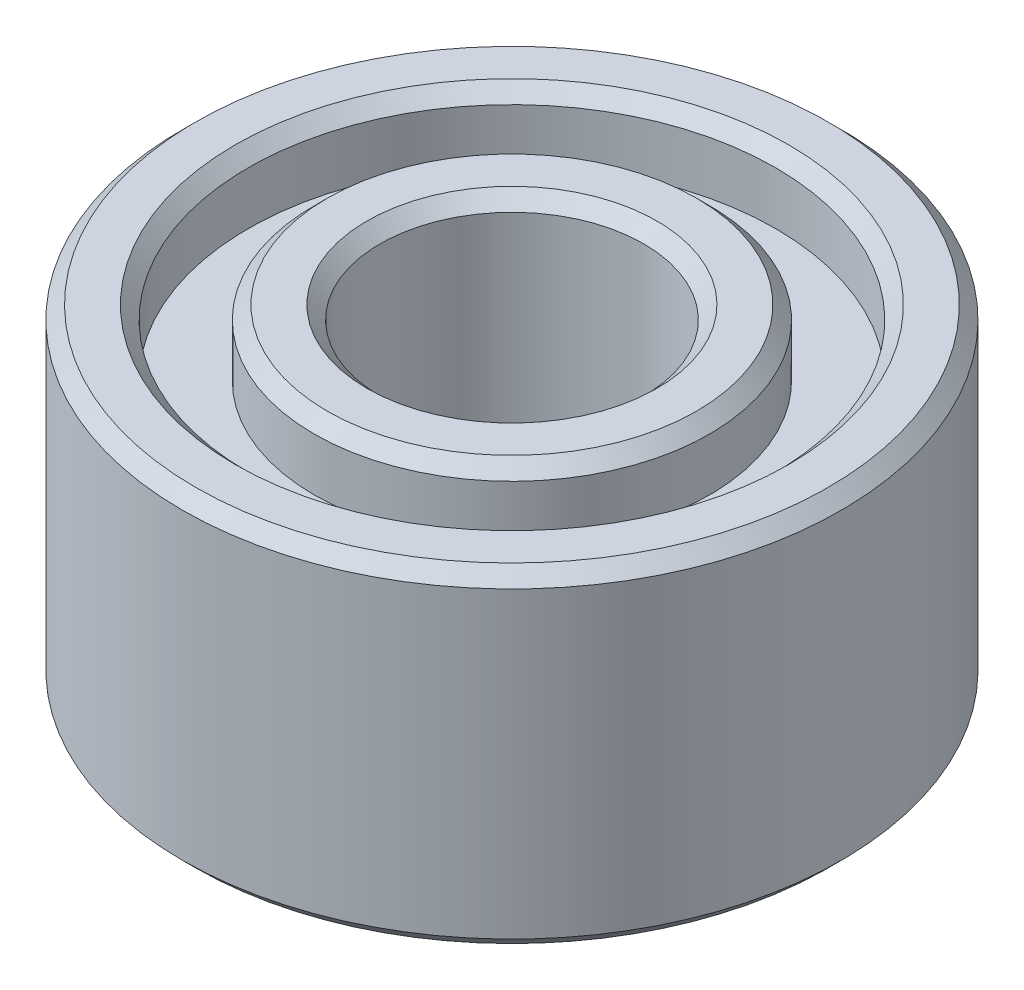
ISO-10303-21;
HEADER;
FILE_DESCRIPTION(('STEP AP214'),'2;1');
FILE_NAME('part.step','',(''),(''),'','','');
FILE_SCHEMA(('AUTOMOTIVE_DESIGN { 1 0 10303 214 1 1 1 1 }'));
ENDSEC;
DATA;
#1=APPLICATION_CONTEXT('core data for automotive mechanical design processes');
#2=APPLICATION_PROTOCOL_DEFINITION('international standard','automotive_design',2000,#1);
#3=PRODUCT_CONTEXT('',#1,'mechanical');
#4=PRODUCT('Part','Part','',(#3));
#5=PRODUCT_RELATED_PRODUCT_CATEGORY('part','',(#4));
#6=PRODUCT_DEFINITION_FORMATION('','',#4);
#7=PRODUCT_DEFINITION_CONTEXT('part definition',#1,'design');
#8=PRODUCT_DEFINITION('design','',#6,#7);
#9=PRODUCT_DEFINITION_SHAPE('','',#8);
#10=(LENGTH_UNIT() NAMED_UNIT(*) SI_UNIT(.MILLI.,.METRE.));
#11=(NAMED_UNIT(*) PLANE_ANGLE_UNIT() SI_UNIT($,.RADIAN.));
#12=(NAMED_UNIT(*) SI_UNIT($,.STERADIAN.) SOLID_ANGLE_UNIT());
#13=UNCERTAINTY_MEASURE_WITH_UNIT(LENGTH_MEASURE(1.E-05),#10,'distance_accuracy_value','');
#14=(GEOMETRIC_REPRESENTATION_CONTEXT(3) GLOBAL_UNCERTAINTY_ASSIGNED_CONTEXT((#13)) GLOBAL_UNIT_ASSIGNED_CONTEXT((#10,
#11,#12)) REPRESENTATION_CONTEXT('',''));
#15=CARTESIAN_POINT('',(0.,0.,0.));
#16=DIRECTION('',(0.,0.,1.));
#17=DIRECTION('',(1.,0.,0.));
#18=AXIS2_PLACEMENT_3D('',#15,#16,#17);
#19=CARTESIAN_POINT('',(0.,0.,0.));
#20=DIRECTION('',(0.,1.,0.));
#21=DIRECTION('',(0.,0.,1.));
#22=AXIS2_PLACEMENT_3D('',#19,#20,#21);
#23=PLANE('',#22);
#24=CARTESIAN_POINT('',(0.,0.,0.));
#25=DIRECTION('',(0.,1.,0.));
#26=DIRECTION('',(0.,0.,1.));
#27=AXIS2_PLACEMENT_3D('',#24,#25,#26);
#28=CIRCLE('',#27,1.);
#29=CARTESIAN_POINT('',(0.,0.,1.));
#30=VERTEX_POINT('',#29);
#31=EDGE_CURVE('E84',#30,#30,#28,.T.);
#32=ORIENTED_EDGE('',*,*,#31,.T.);
#33=EDGE_LOOP('',(#32));
#34=FACE_BOUND('',#33,.T.);
#35=CARTESIAN_POINT('',(0.,0.,0.));
#36=DIRECTION('',(0.,-1.,0.));
#37=DIRECTION('',(0.,0.,-1.));
#38=AXIS2_PLACEMENT_3D('',#35,#36,#37);
#39=CIRCLE('',#38,1.5);
#40=CARTESIAN_POINT('',(0.,0.,-1.5));
#41=VERTEX_POINT('',#40);
#42=EDGE_CURVE('E97',#41,#41,#39,.T.);
#43=ORIENTED_EDGE('',*,*,#42,.T.);
#44=EDGE_LOOP('',(#43));
#45=FACE_BOUND('',#44,.T.);
#46=ADVANCED_FACE('F39',(#34,#45),#23,.F.);
#47=CARTESIAN_POINT('',(0.,2.5,0.));
#48=DIRECTION('',(0.,1.,0.));
#49=DIRECTION('',(0.,0.,1.));
#50=AXIS2_PLACEMENT_3D('',#47,#48,#49);
#51=PLANE('',#50);
#52=CARTESIAN_POINT('',(0.,2.5,0.));
#53=DIRECTION('',(0.,1.,0.));
#54=DIRECTION('',(0.,0.,1.));
#55=AXIS2_PLACEMENT_3D('',#52,#53,#54);
#56=CIRCLE('',#55,1.4);
#57=CARTESIAN_POINT('',(0.,2.5,1.4));
#58=VERTEX_POINT('',#57);
#59=EDGE_CURVE('E63',#58,#58,#56,.T.);
#60=ORIENTED_EDGE('',*,*,#59,.T.);
#61=EDGE_LOOP('',(#60));
#62=FACE_BOUND('',#61,.T.);
#63=CARTESIAN_POINT('',(0.,2.5,0.));
#64=DIRECTION('',(0.,1.,0.));
#65=DIRECTION('',(0.,0.,1.));
#66=AXIS2_PLACEMENT_3D('',#63,#64,#65);
#67=CIRCLE('',#66,1.1);
#68=CARTESIAN_POINT('',(0.,2.5,1.1));
#69=VERTEX_POINT('',#68);
#70=EDGE_CURVE('E66',#69,#69,#67,.F.);
#71=ORIENTED_EDGE('',*,*,#70,.T.);
#72=EDGE_LOOP('',(#71));
#73=FACE_BOUND('',#72,.T.);
#74=ADVANCED_FACE('F125',(#62,#73),#51,.T.);
#75=CARTESIAN_POINT('',(0.,2.5,0.));
#76=DIRECTION('',(0.,1.,0.));
#77=DIRECTION('',(0.,0.,1.));
#78=AXIS2_PLACEMENT_3D('',#75,#76,#77);
#79=CIRCLE('',#78,2.4);
#80=CARTESIAN_POINT('',(0.,2.5,2.4));
#81=VERTEX_POINT('',#80);
#82=EDGE_CURVE('E47',#81,#81,#79,.T.);
#83=ORIENTED_EDGE('',*,*,#82,.T.);
#84=EDGE_LOOP('',(#83));
#85=FACE_BOUND('',#84,.T.);
#86=CARTESIAN_POINT('',(0.,2.5,0.));
#87=DIRECTION('',(0.,1.,0.));
#88=DIRECTION('',(0.,0.,1.));
#89=AXIS2_PLACEMENT_3D('',#86,#87,#88);
#90=CIRCLE('',#89,2.1);
#91=CARTESIAN_POINT('',(0.,2.5,2.1));
#92=VERTEX_POINT('',#91);
#93=EDGE_CURVE('E51',#92,#92,#90,.F.);
#94=ORIENTED_EDGE('',*,*,#93,.T.);
#95=EDGE_LOOP('',(#94));
#96=FACE_BOUND('',#95,.T.);
#97=ADVANCED_FACE('F133',(#85,#96),#51,.T.);
#98=CARTESIAN_POINT('',(0.,0.,0.));
#99=DIRECTION('',(0.,1.,0.));
#100=DIRECTION('',(0.,0.,1.));
#101=AXIS2_PLACEMENT_3D('',#98,#99,#100);
#102=CIRCLE('',#101,2.4);
#103=CARTESIAN_POINT('',(0.,0.,2.4));
#104=VERTEX_POINT('',#103);
#105=EDGE_CURVE('E72',#104,#104,#102,.F.);
#106=ORIENTED_EDGE('',*,*,#105,.T.);
#107=EDGE_LOOP('',(#106));
#108=FACE_BOUND('',#107,.T.);
#109=CARTESIAN_POINT('',(0.,0.,0.));
#110=DIRECTION('',(0.,1.,0.));
#111=DIRECTION('',(0.,0.,1.));
#112=AXIS2_PLACEMENT_3D('',#109,#110,#111);
#113=CIRCLE('',#112,2.1);
#114=CARTESIAN_POINT('',(0.,0.,2.1));
#115=VERTEX_POINT('',#114);
#116=EDGE_CURVE('E75',#115,#115,#113,.T.);
#117=ORIENTED_EDGE('',*,*,#116,.T.);
#118=EDGE_LOOP('',(#117));
#119=FACE_BOUND('',#118,.T.);
#120=ADVANCED_FACE('F128',(#108,#119),#23,.F.);
#121=CARTESIAN_POINT('',(0.,2.5,0.));
#122=DIRECTION('',(0.,-1.,0.));
#123=DIRECTION('',(0.,0.,-1.));
#124=AXIS2_PLACEMENT_3D('',#121,#122,#123);
#125=CYLINDRICAL_SURFACE('',#124,2.5);
#126=CARTESIAN_POINT('',(0.,0.099999999999999,0.));
#127=DIRECTION('',(0.,1.,0.));
#128=DIRECTION('',(0.,0.,1.));
#129=AXIS2_PLACEMENT_3D('',#126,#127,#128);
#130=CIRCLE('',#129,2.5);
#131=CARTESIAN_POINT('',(0.,0.099999999999999,2.5));
#132=VERTEX_POINT('',#131);
#133=EDGE_CURVE('E78',#132,#132,#130,.T.);
#134=ORIENTED_EDGE('',*,*,#133,.T.);
#135=EDGE_LOOP('',(#134));
#136=FACE_BOUND('',#135,.T.);
#137=CARTESIAN_POINT('',(0.,2.4,0.));
#138=DIRECTION('',(0.,1.,0.));
#139=DIRECTION('',(0.,0.,1.));
#140=AXIS2_PLACEMENT_3D('',#137,#138,#139);
#141=CIRCLE('',#140,2.5);
#142=CARTESIAN_POINT('',(0.,2.4,2.5));
#143=VERTEX_POINT('',#142);
#144=EDGE_CURVE('E81',#143,#143,#141,.F.);
#145=ORIENTED_EDGE('',*,*,#144,.T.);
#146=EDGE_LOOP('',(#145));
#147=FACE_BOUND('',#146,.T.);
#148=ADVANCED_FACE('F139',(#136,#147),#125,.T.);
#149=CARTESIAN_POINT('',(0.,2.5,0.));
#150=DIRECTION('',(0.,-1.,0.));
#151=DIRECTION('',(0.,0.,-1.));
#152=AXIS2_PLACEMENT_3D('',#149,#150,#151);
#153=CYLINDRICAL_SURFACE('',#152,1.);
#154=CARTESIAN_POINT('',(0.,2.4,0.));
#155=DIRECTION('',(0.,1.,0.));
#156=DIRECTION('',(0.,0.,1.));
#157=AXIS2_PLACEMENT_3D('',#154,#155,#156);
#158=CIRCLE('',#157,1.);
#159=CARTESIAN_POINT('',(0.,2.4,1.));
#160=VERTEX_POINT('',#159);
#161=EDGE_CURVE('E55',#160,#160,#158,.T.);
#162=ORIENTED_EDGE('',*,*,#161,.T.);
#163=EDGE_LOOP('',(#162));
#164=FACE_BOUND('',#163,.T.);
#165=ORIENTED_EDGE('',*,*,#31,.F.);
#166=EDGE_LOOP('',(#165));
#167=FACE_BOUND('',#166,.T.);
#168=ADVANCED_FACE('F145',(#164,#167),#153,.F.);
#169=CARTESIAN_POINT('',(0.,2.,0.));
#170=DIRECTION('',(0.,1.,0.));
#171=DIRECTION('',(0.,0.,1.));
#172=AXIS2_PLACEMENT_3D('',#169,#170,#171);
#173=CYLINDRICAL_SURFACE('',#172,2.);
#174=CARTESIAN_POINT('',(0.,2.4,0.));
#175=DIRECTION('',(0.,1.,0.));
#176=DIRECTION('',(0.,0.,1.));
#177=AXIS2_PLACEMENT_3D('',#174,#175,#176);
#178=CIRCLE('',#177,2.);
#179=CARTESIAN_POINT('',(0.,2.4,2.));
#180=VERTEX_POINT('',#179);
#181=EDGE_CURVE('E10',#180,#180,#178,.T.);
#182=ORIENTED_EDGE('',*,*,#181,.T.);
#183=EDGE_LOOP('',(#182));
#184=FACE_BOUND('',#183,.T.);
#185=CARTESIAN_POINT('',(0.,2.,0.));
#186=DIRECTION('',(0.,1.,0.));
#187=DIRECTION('',(0.,0.,1.));
#188=AXIS2_PLACEMENT_3D('',#185,#186,#187);
#189=CIRCLE('',#188,2.);
#190=CARTESIAN_POINT('',(0.,2.,2.));
#191=VERTEX_POINT('',#190);
#192=EDGE_CURVE('E87',#191,#191,#189,.T.);
#193=ORIENTED_EDGE('',*,*,#192,.F.);
#194=EDGE_LOOP('',(#193));
#195=FACE_BOUND('',#194,.T.);
#196=ADVANCED_FACE('F261',(#184,#195),#173,.F.);
#197=CARTESIAN_POINT('',(0.,2.,0.));
#198=DIRECTION('',(0.,1.,0.));
#199=DIRECTION('',(0.,0.,1.));
#200=AXIS2_PLACEMENT_3D('',#197,#198,#199);
#201=PLANE('',#200);
#202=CARTESIAN_POINT('',(0.,2.,0.));
#203=DIRECTION('',(0.,1.,0.));
#204=DIRECTION('',(0.,0.,1.));
#205=AXIS2_PLACEMENT_3D('',#202,#203,#204);
#206=CIRCLE('',#205,1.5);
#207=CARTESIAN_POINT('',(0.,2.,1.5));
#208=VERTEX_POINT('',#207);
#209=EDGE_CURVE('E90',#208,#208,#206,.T.);
#210=ORIENTED_EDGE('',*,*,#209,.F.);
#211=EDGE_LOOP('',(#210));
#212=FACE_BOUND('',#211,.T.);
#213=ORIENTED_EDGE('',*,*,#192,.T.);
#214=EDGE_LOOP('',(#213));
#215=FACE_BOUND('',#214,.T.);
#216=ADVANCED_FACE('F121',(#212,#215),#201,.T.);
#217=CARTESIAN_POINT('',(0.,2.,0.));
#218=DIRECTION('',(0.,1.,0.));
#219=DIRECTION('',(0.,0.,1.));
#220=AXIS2_PLACEMENT_3D('',#217,#218,#219);
#221=CYLINDRICAL_SURFACE('',#220,1.5);
#222=CARTESIAN_POINT('',(0.,2.4,0.));
#223=DIRECTION('',(0.,1.,0.));
#224=DIRECTION('',(0.,0.,1.));
#225=AXIS2_PLACEMENT_3D('',#222,#223,#224);
#226=CIRCLE('',#225,1.5);
#227=CARTESIAN_POINT('',(0.,2.4,1.5));
#228=VERTEX_POINT('',#227);
#229=EDGE_CURVE('E60',#228,#228,#226,.F.);
#230=ORIENTED_EDGE('',*,*,#229,.T.);
#231=EDGE_LOOP('',(#230));
#232=FACE_BOUND('',#231,.T.);
#233=ORIENTED_EDGE('',*,*,#209,.T.);
#234=EDGE_LOOP('',(#233));
#235=FACE_BOUND('',#234,.T.);
#236=ADVANCED_FACE('F114',(#232,#235),#221,.T.);
#237=CARTESIAN_POINT('',(0.,0.5,0.));
#238=DIRECTION('',(0.,-1.,0.));
#239=DIRECTION('',(0.,0.,-1.));
#240=AXIS2_PLACEMENT_3D('',#237,#238,#239);
#241=CYLINDRICAL_SURFACE('',#240,2.);
#242=CARTESIAN_POINT('',(0.,0.1,0.));
#243=DIRECTION('',(0.,1.,0.));
#244=DIRECTION('',(0.,0.,1.));
#245=AXIS2_PLACEMENT_3D('',#242,#243,#244);
#246=CIRCLE('',#245,2.);
#247=CARTESIAN_POINT('',(0.,0.1,2.));
#248=VERTEX_POINT('',#247);
#249=EDGE_CURVE('E69',#248,#248,#246,.F.);
#250=ORIENTED_EDGE('',*,*,#249,.T.);
#251=EDGE_LOOP('',(#250));
#252=FACE_BOUND('',#251,.T.);
#253=CARTESIAN_POINT('',(0.,0.5,0.));
#254=DIRECTION('',(0.,-1.,0.));
#255=DIRECTION('',(0.,0.,-1.));
#256=AXIS2_PLACEMENT_3D('',#253,#254,#255);
#257=CIRCLE('',#256,2.);
#258=CARTESIAN_POINT('',(0.,0.5,-2.));
#259=VERTEX_POINT('',#258);
#260=EDGE_CURVE('E93',#259,#259,#257,.T.);
#261=ORIENTED_EDGE('',*,*,#260,.F.);
#262=EDGE_LOOP('',(#261));
#263=FACE_BOUND('',#262,.T.);
#264=ADVANCED_FACE('F109',(#252,#263),#241,.F.);
#265=CARTESIAN_POINT('',(0.,0.5,0.));
#266=DIRECTION('',(0.,-1.,0.));
#267=DIRECTION('',(0.,0.,-1.));
#268=AXIS2_PLACEMENT_3D('',#265,#266,#267);
#269=PLANE('',#268);
#270=CARTESIAN_POINT('',(0.,0.5,0.));
#271=DIRECTION('',(0.,-1.,0.));
#272=DIRECTION('',(0.,0.,-1.));
#273=AXIS2_PLACEMENT_3D('',#270,#271,#272);
#274=CIRCLE('',#273,1.5);
#275=CARTESIAN_POINT('',(0.,0.5,-1.5));
#276=VERTEX_POINT('',#275);
#277=EDGE_CURVE('E96',#276,#276,#274,.T.);
#278=ORIENTED_EDGE('',*,*,#277,.F.);
#279=EDGE_LOOP('',(#278));
#280=FACE_BOUND('',#279,.T.);
#281=ORIENTED_EDGE('',*,*,#260,.T.);
#282=EDGE_LOOP('',(#281));
#283=FACE_BOUND('',#282,.T.);
#284=ADVANCED_FACE('F106',(#280,#283),#269,.T.);
#285=CARTESIAN_POINT('',(0.,0.5,0.));
#286=DIRECTION('',(0.,-1.,0.));
#287=DIRECTION('',(0.,0.,-1.));
#288=AXIS2_PLACEMENT_3D('',#285,#286,#287);
#289=CYLINDRICAL_SURFACE('',#288,1.5);
#290=ORIENTED_EDGE('',*,*,#277,.T.);
#291=EDGE_LOOP('',(#290));
#292=FACE_BOUND('',#291,.T.);
#293=ORIENTED_EDGE('',*,*,#42,.F.);
#294=EDGE_LOOP('',(#293));
#295=FACE_BOUND('',#294,.T.);
#296=ADVANCED_FACE('F103',(#292,#295),#289,.T.);
#297=CARTESIAN_POINT('',(0.,0.099999999999999,0.));
#298=DIRECTION('',(0.,1.,0.));
#299=DIRECTION('',(0.,0.,1.));
#300=AXIS2_PLACEMENT_3D('',#297,#298,#299);
#301=CONICAL_SURFACE('',#300,2.5,0.78539816339745);
#302=ORIENTED_EDGE('',*,*,#105,.F.);
#303=EDGE_LOOP('',(#302));
#304=FACE_BOUND('',#303,.T.);
#305=ORIENTED_EDGE('',*,*,#133,.F.);
#306=EDGE_LOOP('',(#305));
#307=FACE_BOUND('',#306,.T.);
#308=ADVANCED_FACE('F155',(#304,#307),#301,.T.);
#309=CARTESIAN_POINT('',(0.,0.1,0.));
#310=DIRECTION('',(0.,-1.,0.));
#311=DIRECTION('',(0.,0.,-1.));
#312=AXIS2_PLACEMENT_3D('',#309,#310,#311);
#313=CONICAL_SURFACE('',#312,2.,0.785398163397453);
#314=ORIENTED_EDGE('',*,*,#116,.F.);
#315=EDGE_LOOP('',(#314));
#316=FACE_BOUND('',#315,.T.);
#317=ORIENTED_EDGE('',*,*,#249,.F.);
#318=EDGE_LOOP('',(#317));
#319=FACE_BOUND('',#318,.T.);
#320=ADVANCED_FACE('F151',(#316,#319),#313,.F.);
#321=CARTESIAN_POINT('',(0.,2.5,0.));
#322=DIRECTION('',(0.,-1.,0.));
#323=DIRECTION('',(0.,0.,-1.));
#324=AXIS2_PLACEMENT_3D('',#321,#322,#323);
#325=CONICAL_SURFACE('',#324,1.4,0.78539816339745);
#326=ORIENTED_EDGE('',*,*,#229,.F.);
#327=EDGE_LOOP('',(#326));
#328=FACE_BOUND('',#327,.T.);
#329=ORIENTED_EDGE('',*,*,#59,.F.);
#330=EDGE_LOOP('',(#329));
#331=FACE_BOUND('',#330,.T.);
#332=ADVANCED_FACE('F154',(#328,#331),#325,.T.);
#333=CARTESIAN_POINT('',(0.,2.4,0.));
#334=DIRECTION('',(0.,1.,0.));
#335=DIRECTION('',(0.,0.,1.));
#336=AXIS2_PLACEMENT_3D('',#333,#334,#335);
#337=CONICAL_SURFACE('',#336,1.,0.785398163397448);
#338=ORIENTED_EDGE('',*,*,#70,.F.);
#339=EDGE_LOOP('',(#338));
#340=FACE_BOUND('',#339,.T.);
#341=ORIENTED_EDGE('',*,*,#161,.F.);
#342=EDGE_LOOP('',(#341));
#343=FACE_BOUND('',#342,.T.);
#344=ADVANCED_FACE('F161',(#340,#343),#337,.F.);
#345=CARTESIAN_POINT('',(0.,2.5,0.));
#346=DIRECTION('',(0.,-1.,0.));
#347=DIRECTION('',(0.,0.,-1.));
#348=AXIS2_PLACEMENT_3D('',#345,#346,#347);
#349=CONICAL_SURFACE('',#348,2.4,0.785398163397446);
#350=ORIENTED_EDGE('',*,*,#144,.F.);
#351=EDGE_LOOP('',(#350));
#352=FACE_BOUND('',#351,.T.);
#353=ORIENTED_EDGE('',*,*,#82,.F.);
#354=EDGE_LOOP('',(#353));
#355=FACE_BOUND('',#354,.T.);
#356=ADVANCED_FACE('F179',(#352,#355),#349,.T.);
#357=CARTESIAN_POINT('',(0.,2.4,0.));
#358=DIRECTION('',(0.,1.,0.));
#359=DIRECTION('',(0.,0.,1.));
#360=AXIS2_PLACEMENT_3D('',#357,#358,#359);
#361=CONICAL_SURFACE('',#360,2.,0.78539816339745);
#362=ORIENTED_EDGE('',*,*,#93,.F.);
#363=EDGE_LOOP('',(#362));
#364=FACE_BOUND('',#363,.T.);
#365=ORIENTED_EDGE('',*,*,#181,.F.);
#366=EDGE_LOOP('',(#365));
#367=FACE_BOUND('',#366,.T.);
#368=ADVANCED_FACE('F42',(#364,#367),#361,.F.);
#369=CLOSED_SHELL('',(#46,#74,#97,#120,#148,#168,#196,#216,#236,#264,#284,#296,#308,#320,#332,
#344,#356,#368));
#370=MANIFOLD_SOLID_BREP('B2',#369);
#371=ADVANCED_BREP_SHAPE_REPRESENTATION('',(#18,#370),#14);
#372=SHAPE_DEFINITION_REPRESENTATION(#9,#371);
ENDSEC;
END-ISO-10303-21;
